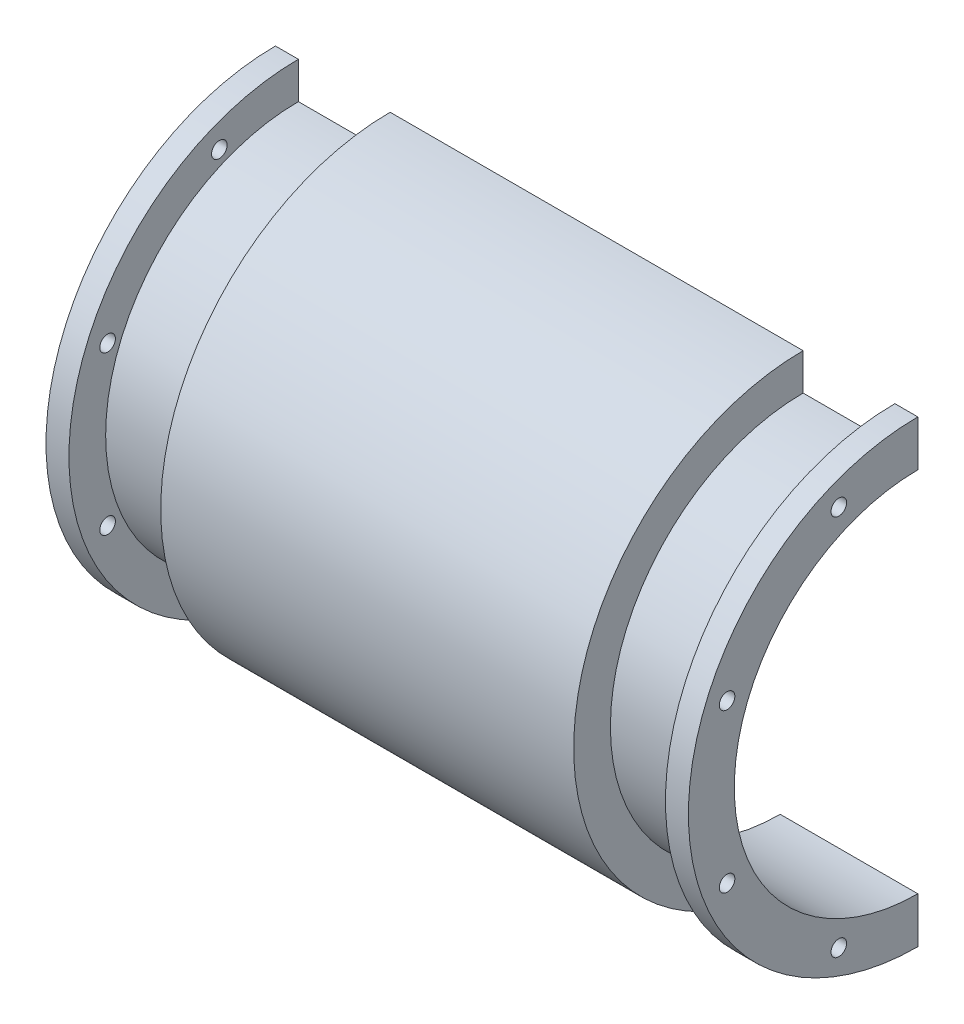
ISO-10303-21;
HEADER;
FILE_DESCRIPTION(('STEP AP214'),'2;1');
FILE_NAME('part.step','',(''),(''),'','','');
FILE_SCHEMA(('AUTOMOTIVE_DESIGN { 1 0 10303 214 1 1 1 1 }'));
ENDSEC;
DATA;
#1=APPLICATION_CONTEXT('core data for automotive mechanical design processes');
#2=APPLICATION_PROTOCOL_DEFINITION('international standard','automotive_design',2000,#1);
#3=PRODUCT_CONTEXT('',#1,'mechanical');
#4=PRODUCT('Part','Part','',(#3));
#5=PRODUCT_RELATED_PRODUCT_CATEGORY('part','',(#4));
#6=PRODUCT_DEFINITION_FORMATION('','',#4);
#7=PRODUCT_DEFINITION_CONTEXT('part definition',#1,'design');
#8=PRODUCT_DEFINITION('design','',#6,#7);
#9=PRODUCT_DEFINITION_SHAPE('','',#8);
#10=(LENGTH_UNIT() NAMED_UNIT(*) SI_UNIT(.MILLI.,.METRE.));
#11=(NAMED_UNIT(*) PLANE_ANGLE_UNIT() SI_UNIT($,.RADIAN.));
#12=(NAMED_UNIT(*) SI_UNIT($,.STERADIAN.) SOLID_ANGLE_UNIT());
#13=UNCERTAINTY_MEASURE_WITH_UNIT(LENGTH_MEASURE(1.E-05),#10,'distance_accuracy_value','');
#14=(GEOMETRIC_REPRESENTATION_CONTEXT(3) GLOBAL_UNCERTAINTY_ASSIGNED_CONTEXT((#13)) GLOBAL_UNIT_ASSIGNED_CONTEXT((#10,
#11,#12)) REPRESENTATION_CONTEXT('',''));
#15=CARTESIAN_POINT('',(0.,0.,0.));
#16=DIRECTION('',(0.,0.,1.));
#17=DIRECTION('',(1.,0.,0.));
#18=AXIS2_PLACEMENT_3D('',#15,#16,#17);
#19=CARTESIAN_POINT('',(70.,-40.,-2.79318507107451E-13));
#20=DIRECTION('',(-1.,0.,0.));
#21=DIRECTION('',(0.,-1.,0.));
#22=AXIS2_PLACEMENT_3D('',#19,#20,#21);
#23=PLANE('',#22);
#24=CARTESIAN_POINT('',(70.,17.2207544564289,41.5745789630079));
#25=DIRECTION('',(1.,0.,0.));
#26=DIRECTION('',(0.,0.,-1.));
#27=AXIS2_PLACEMENT_3D('',#24,#25,#26);
#28=CIRCLE('',#27,1.69999999999999);
#29=CARTESIAN_POINT('',(70.,17.2207544564289,39.874578963008));
#30=VERTEX_POINT('',#29);
#31=EDGE_CURVE('E527',#30,#30,#28,.T.);
#32=ORIENTED_EDGE('',*,*,#31,.F.);
#33=EDGE_LOOP('',(#32));
#34=FACE_BOUND('',#33,.T.);
#35=CARTESIAN_POINT('',(70.,-17.2207544564292,41.5745789630078));
#36=DIRECTION('',(1.,0.,0.));
#37=DIRECTION('',(0.,0.,-1.));
#38=AXIS2_PLACEMENT_3D('',#35,#36,#37);
#39=CIRCLE('',#38,1.69999999999999);
#40=CARTESIAN_POINT('',(70.,-17.2207544564292,39.8745789630078));
#41=VERTEX_POINT('',#40);
#42=EDGE_CURVE('E533',#41,#41,#39,.T.);
#43=ORIENTED_EDGE('',*,*,#42,.F.);
#44=EDGE_LOOP('',(#43));
#45=FACE_BOUND('',#44,.T.);
#46=CARTESIAN_POINT('',(70.,0.,0.));
#47=DIRECTION('',(-1.,0.,0.));
#48=DIRECTION('',(0.,-1.,0.));
#49=AXIS2_PLACEMENT_3D('',#46,#47,#48);
#50=CIRCLE('',#49,50.);
#51=CARTESIAN_POINT('',(70.,-50.,-3.49148133884313E-13));
#52=VERTEX_POINT('',#51);
#53=CARTESIAN_POINT('',(70.,50.,0.));
#54=VERTEX_POINT('',#53);
#55=EDGE_CURVE('E267',#52,#54,#50,.T.);
#56=ORIENTED_EDGE('',*,*,#55,.F.);
#57=DIRECTION('',(0.,-1.,0.));
#58=VECTOR('',#57,1.);
#59=CARTESIAN_POINT('',(70.,-40.,-2.79318507107451E-13));
#60=LINE('',#59,#58);
#61=CARTESIAN_POINT('',(70.,-40.,-2.79318507107451E-13));
#62=VERTEX_POINT('',#61);
#63=EDGE_CURVE('E220',#62,#52,#60,.T.);
#64=ORIENTED_EDGE('',*,*,#63,.F.);
#65=CARTESIAN_POINT('',(70.,0.,0.));
#66=DIRECTION('',(-1.,0.,0.));
#67=DIRECTION('',(0.,-1.,0.));
#68=AXIS2_PLACEMENT_3D('',#65,#66,#67);
#69=CIRCLE('',#68,40.);
#70=CARTESIAN_POINT('',(70.,40.,0.));
#71=VERTEX_POINT('',#70);
#72=EDGE_CURVE('E269',#62,#71,#69,.T.);
#73=ORIENTED_EDGE('',*,*,#72,.T.);
#74=DIRECTION('',(0.,1.,0.));
#75=VECTOR('',#74,1.);
#76=CARTESIAN_POINT('',(70.,40.,0.));
#77=LINE('',#76,#75);
#78=EDGE_CURVE('E182',#71,#54,#77,.T.);
#79=ORIENTED_EDGE('',*,*,#78,.T.);
#80=EDGE_LOOP('',(#56,#64,#73,#79));
#81=FACE_BOUND('',#80,.T.);
#82=CARTESIAN_POINT('',(70.,-41.574578963008,17.2207544564288));
#83=DIRECTION('',(1.,0.,0.));
#84=DIRECTION('',(0.,0.,-1.));
#85=AXIS2_PLACEMENT_3D('',#82,#83,#84);
#86=CIRCLE('',#85,1.69999999999999);
#87=CARTESIAN_POINT('',(70.,-41.574578963008,15.5207544564288));
#88=VERTEX_POINT('',#87);
#89=EDGE_CURVE('E521',#88,#88,#86,.T.);
#90=ORIENTED_EDGE('',*,*,#89,.F.);
#91=EDGE_LOOP('',(#90));
#92=FACE_BOUND('',#91,.T.);
#93=CARTESIAN_POINT('',(70.,41.5745789630079,17.2207544564291));
#94=DIRECTION('',(1.,0.,0.));
#95=DIRECTION('',(0.,0.,-1.));
#96=AXIS2_PLACEMENT_3D('',#93,#94,#95);
#97=CIRCLE('',#96,1.69999999999999);
#98=CARTESIAN_POINT('',(70.,41.5745789630079,15.5207544564291));
#99=VERTEX_POINT('',#98);
#100=EDGE_CURVE('E524',#99,#99,#97,.T.);
#101=ORIENTED_EDGE('',*,*,#100,.F.);
#102=EDGE_LOOP('',(#101));
#103=FACE_BOUND('',#102,.T.);
#104=ADVANCED_FACE('F39',(#34,#45,#81,#92,#103),#23,.F.);
#105=CARTESIAN_POINT('',(-70.,-50.,-3.49148133884313E-13));
#106=DIRECTION('',(1.,0.,0.));
#107=DIRECTION('',(0.,1.,0.));
#108=AXIS2_PLACEMENT_3D('',#105,#106,#107);
#109=PLANE('',#108);
#110=CARTESIAN_POINT('',(-70.,41.5745789630079,17.2207544564291));
#111=DIRECTION('',(-1.,0.,0.));
#112=DIRECTION('',(0.,0.,1.));
#113=AXIS2_PLACEMENT_3D('',#110,#111,#112);
#114=CIRCLE('',#113,1.69999999999999);
#115=CARTESIAN_POINT('',(-70.,41.5745789630079,18.9207544564291));
#116=VERTEX_POINT('',#115);
#117=EDGE_CURVE('E539',#116,#116,#114,.T.);
#118=ORIENTED_EDGE('',*,*,#117,.F.);
#119=EDGE_LOOP('',(#118));
#120=FACE_BOUND('',#119,.T.);
#121=CARTESIAN_POINT('',(-70.,17.2207544564289,41.5745789630079));
#122=DIRECTION('',(-1.,0.,0.));
#123=DIRECTION('',(0.,0.,1.));
#124=AXIS2_PLACEMENT_3D('',#121,#122,#123);
#125=CIRCLE('',#124,1.69999999999999);
#126=CARTESIAN_POINT('',(-70.,17.2207544564289,43.2745789630079));
#127=VERTEX_POINT('',#126);
#128=EDGE_CURVE('E545',#127,#127,#125,.T.);
#129=ORIENTED_EDGE('',*,*,#128,.F.);
#130=EDGE_LOOP('',(#129));
#131=FACE_BOUND('',#130,.T.);
#132=CARTESIAN_POINT('',(-70.,-17.2207544564292,41.5745789630078));
#133=DIRECTION('',(-1.,0.,0.));
#134=DIRECTION('',(0.,0.,1.));
#135=AXIS2_PLACEMENT_3D('',#132,#133,#134);
#136=CIRCLE('',#135,1.69999999999999);
#137=CARTESIAN_POINT('',(-70.,-17.2207544564292,43.2745789630078));
#138=VERTEX_POINT('',#137);
#139=EDGE_CURVE('E551',#138,#138,#136,.T.);
#140=ORIENTED_EDGE('',*,*,#139,.F.);
#141=EDGE_LOOP('',(#140));
#142=FACE_BOUND('',#141,.T.);
#143=CARTESIAN_POINT('',(-70.,-41.574578963008,17.2207544564288));
#144=DIRECTION('',(-1.,0.,0.));
#145=DIRECTION('',(0.,0.,1.));
#146=AXIS2_PLACEMENT_3D('',#143,#144,#145);
#147=CIRCLE('',#146,1.69999999999999);
#148=CARTESIAN_POINT('',(-70.,-41.574578963008,18.9207544564288));
#149=VERTEX_POINT('',#148);
#150=EDGE_CURVE('E557',#149,#149,#147,.T.);
#151=ORIENTED_EDGE('',*,*,#150,.F.);
#152=EDGE_LOOP('',(#151));
#153=FACE_BOUND('',#152,.T.);
#154=CARTESIAN_POINT('',(-70.,0.,0.));
#155=DIRECTION('',(-1.,0.,0.));
#156=DIRECTION('',(0.,-1.,0.));
#157=AXIS2_PLACEMENT_3D('',#154,#155,#156);
#158=CIRCLE('',#157,40.);
#159=CARTESIAN_POINT('',(-70.,-40.,-2.79318507107451E-13));
#160=VERTEX_POINT('',#159);
#161=CARTESIAN_POINT('',(-70.,40.,0.));
#162=VERTEX_POINT('',#161);
#163=EDGE_CURVE('E152',#160,#162,#158,.T.);
#164=ORIENTED_EDGE('',*,*,#163,.F.);
#165=DIRECTION('',(0.,1.,0.));
#166=VECTOR('',#165,1.);
#167=CARTESIAN_POINT('',(-70.,-50.,-3.49148133884313E-13));
#168=LINE('',#167,#166);
#169=CARTESIAN_POINT('',(-70.,-50.,-3.49148133884313E-13));
#170=VERTEX_POINT('',#169);
#171=EDGE_CURVE('E211',#170,#160,#168,.T.);
#172=ORIENTED_EDGE('',*,*,#171,.F.);
#173=CARTESIAN_POINT('',(-70.,0.,0.));
#174=DIRECTION('',(-1.,0.,0.));
#175=DIRECTION('',(0.,-1.,0.));
#176=AXIS2_PLACEMENT_3D('',#173,#174,#175);
#177=CIRCLE('',#176,50.);
#178=CARTESIAN_POINT('',(-70.,50.,0.));
#179=VERTEX_POINT('',#178);
#180=EDGE_CURVE('E168',#170,#179,#177,.T.);
#181=ORIENTED_EDGE('',*,*,#180,.T.);
#182=DIRECTION('',(0.,-1.,0.));
#183=VECTOR('',#182,1.);
#184=CARTESIAN_POINT('',(-70.,50.,0.));
#185=LINE('',#184,#183);
#186=EDGE_CURVE('E166',#179,#162,#185,.T.);
#187=ORIENTED_EDGE('',*,*,#186,.T.);
#188=EDGE_LOOP('',(#164,#172,#181,#187));
#189=FACE_BOUND('',#188,.T.);
#190=ADVANCED_FACE('F167',(#120,#131,#142,#153,#189),#109,.F.);
#191=CARTESIAN_POINT('',(-50.,0.,0.));
#192=DIRECTION('',(-1.,0.,0.));
#193=DIRECTION('',(0.,-1.,0.));
#194=AXIS2_PLACEMENT_3D('',#191,#192,#193);
#195=CYLINDRICAL_SURFACE('',#194,40.);
#196=CARTESIAN_POINT('',(-40.,0.,0.));
#197=DIRECTION('',(-1.,0.,0.));
#198=DIRECTION('',(0.,-1.,0.));
#199=AXIS2_PLACEMENT_3D('',#196,#197,#198);
#200=CIRCLE('',#199,40.);
#201=CARTESIAN_POINT('',(-40.,-40.,-2.79318507107451E-13));
#202=VERTEX_POINT('',#201);
#203=CARTESIAN_POINT('',(-40.,40.,0.));
#204=VERTEX_POINT('',#203);
#205=EDGE_CURVE('E163',#202,#204,#200,.T.);
#206=ORIENTED_EDGE('',*,*,#205,.F.);
#207=DIRECTION('',(1.,0.,0.));
#208=VECTOR('',#207,1.);
#209=CARTESIAN_POINT('',(-70.,-40.,-2.79318507107451E-13));
#210=LINE('',#209,#208);
#211=EDGE_CURVE('E158',#160,#202,#210,.T.);
#212=ORIENTED_EDGE('',*,*,#211,.F.);
#213=ORIENTED_EDGE('',*,*,#163,.T.);
#214=DIRECTION('',(1.,0.,0.));
#215=VECTOR('',#214,1.);
#216=CARTESIAN_POINT('',(-70.,40.,0.));
#217=LINE('',#216,#215);
#218=EDGE_CURVE('E156',#162,#204,#217,.T.);
#219=ORIENTED_EDGE('',*,*,#218,.T.);
#220=EDGE_LOOP('',(#206,#212,#213,#219));
#221=FACE_BOUND('',#220,.T.);
#222=ADVANCED_FACE('F154',(#221),#195,.F.);
#223=CARTESIAN_POINT('',(-50.,0.,0.));
#224=DIRECTION('',(-1.,0.,0.));
#225=DIRECTION('',(0.,-1.,0.));
#226=AXIS2_PLACEMENT_3D('',#223,#224,#225);
#227=CYLINDRICAL_SURFACE('',#226,49.);
#228=DIRECTION('',(1.,0.,0.));
#229=VECTOR('',#228,1.);
#230=CARTESIAN_POINT('',(-40.,-49.,-3.42165171206627E-13));
#231=LINE('',#230,#229);
#232=CARTESIAN_POINT('',(-30.9999999999999,-49.,-3.42165171206627E-13));
#233=VERTEX_POINT('',#232);
#234=CARTESIAN_POINT('',(31.,-49.,-3.42165171206627E-13));
#235=VERTEX_POINT('',#234);
#236=EDGE_CURVE('E214',#233,#235,#231,.T.);
#237=ORIENTED_EDGE('',*,*,#236,.F.);
#238=CARTESIAN_POINT('',(-31.,0.,0.));
#239=DIRECTION('',(-1.,0.,0.));
#240=DIRECTION('',(0.,-1.,0.));
#241=AXIS2_PLACEMENT_3D('',#238,#239,#240);
#242=CIRCLE('',#241,49.);
#243=CARTESIAN_POINT('',(-31.,49.,0.));
#244=VERTEX_POINT('',#243);
#245=EDGE_CURVE('E276',#233,#244,#242,.T.);
#246=ORIENTED_EDGE('',*,*,#245,.T.);
#247=DIRECTION('',(1.,0.,0.));
#248=VECTOR('',#247,1.);
#249=CARTESIAN_POINT('',(-40.,49.,0.));
#250=LINE('',#249,#248);
#251=CARTESIAN_POINT('',(31.,49.,0.));
#252=VERTEX_POINT('',#251);
#253=EDGE_CURVE('E174',#244,#252,#250,.T.);
#254=ORIENTED_EDGE('',*,*,#253,.T.);
#255=CARTESIAN_POINT('',(31.,0.,0.));
#256=DIRECTION('',(1.,0.,0.));
#257=DIRECTION('',(0.,1.,0.));
#258=AXIS2_PLACEMENT_3D('',#255,#256,#257);
#259=CIRCLE('',#258,49.);
#260=EDGE_CURVE('E162',#252,#235,#259,.T.);
#261=ORIENTED_EDGE('',*,*,#260,.T.);
#262=EDGE_LOOP('',(#237,#246,#254,#261));
#263=FACE_BOUND('',#262,.T.);
#264=ADVANCED_FACE('F286',(#263),#227,.F.);
#265=CARTESIAN_POINT('',(-50.,0.,0.));
#266=DIRECTION('',(-1.,0.,0.));
#267=DIRECTION('',(0.,-1.,0.));
#268=AXIS2_PLACEMENT_3D('',#265,#266,#267);
#269=CYLINDRICAL_SURFACE('',#268,40.);
#270=ORIENTED_EDGE('',*,*,#72,.F.);
#271=DIRECTION('',(1.,0.,0.));
#272=VECTOR('',#271,1.);
#273=CARTESIAN_POINT('',(40.,-40.,-2.79318507107451E-13));
#274=LINE('',#273,#272);
#275=CARTESIAN_POINT('',(40.,-40.,-2.79318507107451E-13));
#276=VERTEX_POINT('',#275);
#277=EDGE_CURVE('E217',#276,#62,#274,.T.);
#278=ORIENTED_EDGE('',*,*,#277,.F.);
#279=CARTESIAN_POINT('',(40.,0.,0.));
#280=DIRECTION('',(-1.,0.,0.));
#281=DIRECTION('',(0.,-1.,0.));
#282=AXIS2_PLACEMENT_3D('',#279,#280,#281);
#283=CIRCLE('',#282,40.);
#284=CARTESIAN_POINT('',(40.,40.,0.));
#285=VERTEX_POINT('',#284);
#286=EDGE_CURVE('E271',#276,#285,#283,.T.);
#287=ORIENTED_EDGE('',*,*,#286,.T.);
#288=DIRECTION('',(1.,0.,0.));
#289=VECTOR('',#288,1.);
#290=CARTESIAN_POINT('',(40.,40.,0.));
#291=LINE('',#290,#289);
#292=EDGE_CURVE('E176',#285,#71,#291,.T.);
#293=ORIENTED_EDGE('',*,*,#292,.T.);
#294=EDGE_LOOP('',(#270,#278,#287,#293));
#295=FACE_BOUND('',#294,.T.);
#296=ADVANCED_FACE('F317',(#295),#269,.F.);
#297=CARTESIAN_POINT('',(-50.,0.,0.));
#298=DIRECTION('',(-1.,0.,0.));
#299=DIRECTION('',(0.,-1.,0.));
#300=AXIS2_PLACEMENT_3D('',#297,#298,#299);
#301=CYLINDRICAL_SURFACE('',#300,50.);
#302=CARTESIAN_POINT('',(65.,0.,0.));
#303=DIRECTION('',(-1.,0.,0.));
#304=DIRECTION('',(0.,-1.,0.));
#305=AXIS2_PLACEMENT_3D('',#302,#303,#304);
#306=CIRCLE('',#305,50.);
#307=CARTESIAN_POINT('',(65.,-50.,-3.49148133884313E-13));
#308=VERTEX_POINT('',#307);
#309=CARTESIAN_POINT('',(65.,50.,0.));
#310=VERTEX_POINT('',#309);
#311=EDGE_CURVE('E265',#308,#310,#306,.T.);
#312=ORIENTED_EDGE('',*,*,#311,.F.);
#313=DIRECTION('',(-1.,0.,0.));
#314=VECTOR('',#313,1.);
#315=CARTESIAN_POINT('',(70.,-50.,-3.49148133884313E-13));
#316=LINE('',#315,#314);
#317=EDGE_CURVE('E223',#52,#308,#316,.T.);
#318=ORIENTED_EDGE('',*,*,#317,.F.);
#319=ORIENTED_EDGE('',*,*,#55,.T.);
#320=DIRECTION('',(-1.,0.,0.));
#321=VECTOR('',#320,1.);
#322=CARTESIAN_POINT('',(70.,50.,0.));
#323=LINE('',#322,#321);
#324=EDGE_CURVE('E185',#54,#310,#323,.T.);
#325=ORIENTED_EDGE('',*,*,#324,.T.);
#326=EDGE_LOOP('',(#312,#318,#319,#325));
#327=FACE_BOUND('',#326,.T.);
#328=ADVANCED_FACE('F315',(#327),#301,.T.);
#329=CARTESIAN_POINT('',(65.,-50.,-3.49148133884313E-13));
#330=DIRECTION('',(1.,0.,0.));
#331=DIRECTION('',(0.,1.,0.));
#332=AXIS2_PLACEMENT_3D('',#329,#330,#331);
#333=PLANE('',#332);
#334=CARTESIAN_POINT('',(65.,41.5745789630079,17.2207544564291));
#335=DIRECTION('',(1.,0.,0.));
#336=DIRECTION('',(0.,1.,0.));
#337=AXIS2_PLACEMENT_3D('',#334,#335,#336);
#338=CIRCLE('',#337,1.69999999999999);
#339=CARTESIAN_POINT('',(65.,43.2745789630079,17.2207544564291));
#340=VERTEX_POINT('',#339);
#341=EDGE_CURVE('E482',#340,#340,#338,.T.);
#342=ORIENTED_EDGE('',*,*,#341,.T.);
#343=EDGE_LOOP('',(#342));
#344=FACE_BOUND('',#343,.T.);
#345=CARTESIAN_POINT('',(65.,17.2207544564289,41.5745789630079));
#346=DIRECTION('',(1.,0.,0.));
#347=DIRECTION('',(0.,1.,0.));
#348=AXIS2_PLACEMENT_3D('',#345,#346,#347);
#349=CIRCLE('',#348,1.69999999999999);
#350=CARTESIAN_POINT('',(65.,18.9207544564289,41.5745789630079));
#351=VERTEX_POINT('',#350);
#352=EDGE_CURVE('E485',#351,#351,#349,.T.);
#353=ORIENTED_EDGE('',*,*,#352,.T.);
#354=EDGE_LOOP('',(#353));
#355=FACE_BOUND('',#354,.T.);
#356=CARTESIAN_POINT('',(65.,-17.2207544564292,41.5745789630078));
#357=DIRECTION('',(1.,0.,0.));
#358=DIRECTION('',(0.,1.,0.));
#359=AXIS2_PLACEMENT_3D('',#356,#357,#358);
#360=CIRCLE('',#359,1.69999999999999);
#361=CARTESIAN_POINT('',(65.,-15.5207544564292,41.5745789630078));
#362=VERTEX_POINT('',#361);
#363=EDGE_CURVE('E489',#362,#362,#360,.T.);
#364=ORIENTED_EDGE('',*,*,#363,.T.);
#365=EDGE_LOOP('',(#364));
#366=FACE_BOUND('',#365,.T.);
#367=CARTESIAN_POINT('',(65.,-41.574578963008,17.2207544564288));
#368=DIRECTION('',(1.,0.,0.));
#369=DIRECTION('',(0.,1.,0.));
#370=AXIS2_PLACEMENT_3D('',#367,#368,#369);
#371=CIRCLE('',#370,1.69999999999999);
#372=CARTESIAN_POINT('',(65.,-39.874578963008,17.2207544564288));
#373=VERTEX_POINT('',#372);
#374=EDGE_CURVE('E493',#373,#373,#371,.T.);
#375=ORIENTED_EDGE('',*,*,#374,.T.);
#376=EDGE_LOOP('',(#375));
#377=FACE_BOUND('',#376,.T.);
#378=CARTESIAN_POINT('',(65.,0.,0.));
#379=DIRECTION('',(-1.,0.,0.));
#380=DIRECTION('',(0.,-1.,0.));
#381=AXIS2_PLACEMENT_3D('',#378,#379,#380);
#382=CIRCLE('',#381,42.);
#383=CARTESIAN_POINT('',(65.,-42.,-2.93284432462823E-13));
#384=VERTEX_POINT('',#383);
#385=CARTESIAN_POINT('',(65.,42.,0.));
#386=VERTEX_POINT('',#385);
#387=EDGE_CURVE('E263',#384,#386,#382,.T.);
#388=ORIENTED_EDGE('',*,*,#387,.F.);
#389=DIRECTION('',(0.,1.,0.));
#390=VECTOR('',#389,1.);
#391=CARTESIAN_POINT('',(65.,-50.,-3.49148133884313E-13));
#392=LINE('',#391,#390);
#393=EDGE_CURVE('E226',#308,#384,#392,.T.);
#394=ORIENTED_EDGE('',*,*,#393,.F.);
#395=ORIENTED_EDGE('',*,*,#311,.T.);
#396=DIRECTION('',(0.,-1.,0.));
#397=VECTOR('',#396,1.);
#398=CARTESIAN_POINT('',(65.,50.,0.));
#399=LINE('',#398,#397);
#400=EDGE_CURVE('E188',#310,#386,#399,.T.);
#401=ORIENTED_EDGE('',*,*,#400,.T.);
#402=EDGE_LOOP('',(#388,#394,#395,#401));
#403=FACE_BOUND('',#402,.T.);
#404=ADVANCED_FACE('F472',(#344,#355,#366,#377,#403),#333,.F.);
#405=CARTESIAN_POINT('',(-50.,0.,0.));
#406=DIRECTION('',(-1.,0.,0.));
#407=DIRECTION('',(0.,-1.,0.));
#408=AXIS2_PLACEMENT_3D('',#405,#406,#407);
#409=CYLINDRICAL_SURFACE('',#408,42.);
#410=CARTESIAN_POINT('',(45.,0.,0.));
#411=DIRECTION('',(-1.,0.,0.));
#412=DIRECTION('',(0.,-1.,0.));
#413=AXIS2_PLACEMENT_3D('',#410,#411,#412);
#414=CIRCLE('',#413,42.);
#415=CARTESIAN_POINT('',(45.,-42.,-2.93284432462823E-13));
#416=VERTEX_POINT('',#415);
#417=CARTESIAN_POINT('',(45.,42.,0.));
#418=VERTEX_POINT('',#417);
#419=EDGE_CURVE('E261',#416,#418,#414,.T.);
#420=ORIENTED_EDGE('',*,*,#419,.F.);
#421=DIRECTION('',(-1.,0.,0.));
#422=VECTOR('',#421,1.);
#423=CARTESIAN_POINT('',(65.,-42.,-2.93284432462823E-13));
#424=LINE('',#423,#422);
#425=EDGE_CURVE('E229',#384,#416,#424,.T.);
#426=ORIENTED_EDGE('',*,*,#425,.F.);
#427=ORIENTED_EDGE('',*,*,#387,.T.);
#428=DIRECTION('',(-1.,0.,0.));
#429=VECTOR('',#428,1.);
#430=CARTESIAN_POINT('',(65.,42.,0.));
#431=LINE('',#430,#429);
#432=EDGE_CURVE('E191',#386,#418,#431,.T.);
#433=ORIENTED_EDGE('',*,*,#432,.T.);
#434=EDGE_LOOP('',(#420,#426,#427,#433));
#435=FACE_BOUND('',#434,.T.);
#436=ADVANCED_FACE('F469',(#435),#409,.T.);
#437=CARTESIAN_POINT('',(45.,-42.,-2.93284432462823E-13));
#438=DIRECTION('',(-1.,0.,0.));
#439=DIRECTION('',(0.,-1.,0.));
#440=AXIS2_PLACEMENT_3D('',#437,#438,#439);
#441=PLANE('',#440);
#442=CARTESIAN_POINT('',(45.,0.,0.));
#443=DIRECTION('',(-1.,0.,0.));
#444=DIRECTION('',(0.,-1.,0.));
#445=AXIS2_PLACEMENT_3D('',#442,#443,#444);
#446=CIRCLE('',#445,50.);
#447=CARTESIAN_POINT('',(45.,-50.,-3.49148133884313E-13));
#448=VERTEX_POINT('',#447);
#449=CARTESIAN_POINT('',(45.,50.,0.));
#450=VERTEX_POINT('',#449);
#451=EDGE_CURVE('E259',#448,#450,#446,.T.);
#452=ORIENTED_EDGE('',*,*,#451,.F.);
#453=DIRECTION('',(0.,-1.,0.));
#454=VECTOR('',#453,1.);
#455=CARTESIAN_POINT('',(45.,-42.,-2.93284432462823E-13));
#456=LINE('',#455,#454);
#457=EDGE_CURVE('E232',#416,#448,#456,.T.);
#458=ORIENTED_EDGE('',*,*,#457,.F.);
#459=ORIENTED_EDGE('',*,*,#419,.T.);
#460=DIRECTION('',(0.,1.,0.));
#461=VECTOR('',#460,1.);
#462=CARTESIAN_POINT('',(45.,42.,0.));
#463=LINE('',#462,#461);
#464=EDGE_CURVE('E194',#418,#450,#463,.T.);
#465=ORIENTED_EDGE('',*,*,#464,.T.);
#466=EDGE_LOOP('',(#452,#458,#459,#465));
#467=FACE_BOUND('',#466,.T.);
#468=ADVANCED_FACE('F465',(#467),#441,.F.);
#469=CARTESIAN_POINT('',(-50.,0.,0.));
#470=DIRECTION('',(-1.,0.,0.));
#471=DIRECTION('',(0.,-1.,0.));
#472=AXIS2_PLACEMENT_3D('',#469,#470,#471);
#473=CYLINDRICAL_SURFACE('',#472,50.);
#474=CARTESIAN_POINT('',(-45.,0.,0.));
#475=DIRECTION('',(-1.,0.,0.));
#476=DIRECTION('',(0.,-1.,0.));
#477=AXIS2_PLACEMENT_3D('',#474,#475,#476);
#478=CIRCLE('',#477,50.);
#479=CARTESIAN_POINT('',(-45.,-50.,-3.49148133884313E-13));
#480=VERTEX_POINT('',#479);
#481=CARTESIAN_POINT('',(-45.,50.,0.));
#482=VERTEX_POINT('',#481);
#483=EDGE_CURVE('E257',#480,#482,#478,.T.);
#484=ORIENTED_EDGE('',*,*,#483,.F.);
#485=DIRECTION('',(-1.,0.,0.));
#486=VECTOR('',#485,1.);
#487=CARTESIAN_POINT('',(45.,-50.,-3.49148133884313E-13));
#488=LINE('',#487,#486);
#489=EDGE_CURVE('E235',#448,#480,#488,.T.);
#490=ORIENTED_EDGE('',*,*,#489,.F.);
#491=ORIENTED_EDGE('',*,*,#451,.T.);
#492=DIRECTION('',(-1.,0.,0.));
#493=VECTOR('',#492,1.);
#494=CARTESIAN_POINT('',(45.,50.,0.));
#495=LINE('',#494,#493);
#496=EDGE_CURVE('E197',#450,#482,#495,.T.);
#497=ORIENTED_EDGE('',*,*,#496,.T.);
#498=EDGE_LOOP('',(#484,#490,#491,#497));
#499=FACE_BOUND('',#498,.T.);
#500=ADVANCED_FACE('F461',(#499),#473,.T.);
#501=CARTESIAN_POINT('',(-45.,-50.,-3.49148133884313E-13));
#502=DIRECTION('',(1.,0.,0.));
#503=DIRECTION('',(0.,1.,0.));
#504=AXIS2_PLACEMENT_3D('',#501,#502,#503);
#505=PLANE('',#504);
#506=CARTESIAN_POINT('',(-45.,0.,0.));
#507=DIRECTION('',(-1.,0.,0.));
#508=DIRECTION('',(0.,-1.,0.));
#509=AXIS2_PLACEMENT_3D('',#506,#507,#508);
#510=CIRCLE('',#509,42.);
#511=CARTESIAN_POINT('',(-45.,-42.,-2.93284432462823E-13));
#512=VERTEX_POINT('',#511);
#513=CARTESIAN_POINT('',(-45.,42.,0.));
#514=VERTEX_POINT('',#513);
#515=EDGE_CURVE('E255',#512,#514,#510,.T.);
#516=ORIENTED_EDGE('',*,*,#515,.F.);
#517=DIRECTION('',(0.,1.,0.));
#518=VECTOR('',#517,1.);
#519=CARTESIAN_POINT('',(-45.,-50.,-3.49148133884313E-13));
#520=LINE('',#519,#518);
#521=EDGE_CURVE('E238',#480,#512,#520,.T.);
#522=ORIENTED_EDGE('',*,*,#521,.F.);
#523=ORIENTED_EDGE('',*,*,#483,.T.);
#524=DIRECTION('',(0.,-1.,0.));
#525=VECTOR('',#524,1.);
#526=CARTESIAN_POINT('',(-45.,50.,0.));
#527=LINE('',#526,#525);
#528=EDGE_CURVE('E200',#482,#514,#527,.T.);
#529=ORIENTED_EDGE('',*,*,#528,.T.);
#530=EDGE_LOOP('',(#516,#522,#523,#529));
#531=FACE_BOUND('',#530,.T.);
#532=ADVANCED_FACE('F457',(#531),#505,.F.);
#533=CARTESIAN_POINT('',(-50.,0.,0.));
#534=DIRECTION('',(-1.,0.,0.));
#535=DIRECTION('',(0.,-1.,0.));
#536=AXIS2_PLACEMENT_3D('',#533,#534,#535);
#537=CYLINDRICAL_SURFACE('',#536,42.);
#538=CARTESIAN_POINT('',(-65.,0.,0.));
#539=DIRECTION('',(-1.,0.,0.));
#540=DIRECTION('',(0.,-1.,0.));
#541=AXIS2_PLACEMENT_3D('',#538,#539,#540);
#542=CIRCLE('',#541,42.);
#543=CARTESIAN_POINT('',(-65.,-42.,-2.93284432462823E-13));
#544=VERTEX_POINT('',#543);
#545=CARTESIAN_POINT('',(-65.,42.,0.));
#546=VERTEX_POINT('',#545);
#547=EDGE_CURVE('E253',#544,#546,#542,.T.);
#548=ORIENTED_EDGE('',*,*,#547,.F.);
#549=DIRECTION('',(-1.,0.,0.));
#550=VECTOR('',#549,1.);
#551=CARTESIAN_POINT('',(-45.,-42.,-2.93284432462823E-13));
#552=LINE('',#551,#550);
#553=EDGE_CURVE('E241',#512,#544,#552,.T.);
#554=ORIENTED_EDGE('',*,*,#553,.F.);
#555=ORIENTED_EDGE('',*,*,#515,.T.);
#556=DIRECTION('',(-1.,0.,0.));
#557=VECTOR('',#556,1.);
#558=CARTESIAN_POINT('',(-45.,42.,0.));
#559=LINE('',#558,#557);
#560=EDGE_CURVE('E203',#514,#546,#559,.T.);
#561=ORIENTED_EDGE('',*,*,#560,.T.);
#562=EDGE_LOOP('',(#548,#554,#555,#561));
#563=FACE_BOUND('',#562,.T.);
#564=ADVANCED_FACE('F453',(#563),#537,.T.);
#565=CARTESIAN_POINT('',(-65.,-42.,-2.93284432462823E-13));
#566=DIRECTION('',(-1.,0.,0.));
#567=DIRECTION('',(0.,-1.,0.));
#568=AXIS2_PLACEMENT_3D('',#565,#566,#567);
#569=PLANE('',#568);
#570=CARTESIAN_POINT('',(-65.,41.5745789630079,17.2207544564291));
#571=DIRECTION('',(-1.,0.,0.));
#572=DIRECTION('',(0.,-1.,0.));
#573=AXIS2_PLACEMENT_3D('',#570,#571,#572);
#574=CIRCLE('',#573,1.69999999999999);
#575=CARTESIAN_POINT('',(-65.,39.8745789630079,17.2207544564291));
#576=VERTEX_POINT('',#575);
#577=EDGE_CURVE('E542',#576,#576,#574,.T.);
#578=ORIENTED_EDGE('',*,*,#577,.T.);
#579=EDGE_LOOP('',(#578));
#580=FACE_BOUND('',#579,.T.);
#581=CARTESIAN_POINT('',(-65.,17.2207544564289,41.5745789630079));
#582=DIRECTION('',(-1.,0.,0.));
#583=DIRECTION('',(0.,-1.,0.));
#584=AXIS2_PLACEMENT_3D('',#581,#582,#583);
#585=CIRCLE('',#584,1.69999999999999);
#586=CARTESIAN_POINT('',(-65.,15.5207544564289,41.5745789630079));
#587=VERTEX_POINT('',#586);
#588=EDGE_CURVE('E548',#587,#587,#585,.T.);
#589=ORIENTED_EDGE('',*,*,#588,.T.);
#590=EDGE_LOOP('',(#589));
#591=FACE_BOUND('',#590,.T.);
#592=CARTESIAN_POINT('',(-65.,-17.2207544564292,41.5745789630078));
#593=DIRECTION('',(-1.,0.,0.));
#594=DIRECTION('',(0.,-1.,0.));
#595=AXIS2_PLACEMENT_3D('',#592,#593,#594);
#596=CIRCLE('',#595,1.69999999999999);
#597=CARTESIAN_POINT('',(-65.,-18.9207544564292,41.5745789630078));
#598=VERTEX_POINT('',#597);
#599=EDGE_CURVE('E554',#598,#598,#596,.T.);
#600=ORIENTED_EDGE('',*,*,#599,.T.);
#601=EDGE_LOOP('',(#600));
#602=FACE_BOUND('',#601,.T.);
#603=CARTESIAN_POINT('',(-65.,-41.574578963008,17.2207544564288));
#604=DIRECTION('',(-1.,0.,0.));
#605=DIRECTION('',(0.,-1.,0.));
#606=AXIS2_PLACEMENT_3D('',#603,#604,#605);
#607=CIRCLE('',#606,1.69999999999999);
#608=CARTESIAN_POINT('',(-65.,-43.274578963008,17.2207544564288));
#609=VERTEX_POINT('',#608);
#610=EDGE_CURVE('E171',#609,#609,#607,.T.);
#611=ORIENTED_EDGE('',*,*,#610,.T.);
#612=EDGE_LOOP('',(#611));
#613=FACE_BOUND('',#612,.T.);
#614=CARTESIAN_POINT('',(-65.,0.,0.));
#615=DIRECTION('',(-1.,0.,0.));
#616=DIRECTION('',(0.,-1.,0.));
#617=AXIS2_PLACEMENT_3D('',#614,#615,#616);
#618=CIRCLE('',#617,50.);
#619=CARTESIAN_POINT('',(-65.,-50.,-3.49148133884313E-13));
#620=VERTEX_POINT('',#619);
#621=CARTESIAN_POINT('',(-65.,50.,0.));
#622=VERTEX_POINT('',#621);
#623=EDGE_CURVE('E251',#620,#622,#618,.T.);
#624=ORIENTED_EDGE('',*,*,#623,.F.);
#625=DIRECTION('',(0.,-1.,0.));
#626=VECTOR('',#625,1.);
#627=CARTESIAN_POINT('',(-65.,-42.,-2.93284432462823E-13));
#628=LINE('',#627,#626);
#629=EDGE_CURVE('E244',#544,#620,#628,.T.);
#630=ORIENTED_EDGE('',*,*,#629,.F.);
#631=ORIENTED_EDGE('',*,*,#547,.T.);
#632=DIRECTION('',(0.,1.,0.));
#633=VECTOR('',#632,1.);
#634=CARTESIAN_POINT('',(-65.,42.,0.));
#635=LINE('',#634,#633);
#636=EDGE_CURVE('E206',#546,#622,#635,.T.);
#637=ORIENTED_EDGE('',*,*,#636,.T.);
#638=EDGE_LOOP('',(#624,#630,#631,#637));
#639=FACE_BOUND('',#638,.T.);
#640=ADVANCED_FACE('F450',(#580,#591,#602,#613,#639),#569,.F.);
#641=CARTESIAN_POINT('',(-50.,0.,0.));
#642=DIRECTION('',(-1.,0.,0.));
#643=DIRECTION('',(0.,-1.,0.));
#644=AXIS2_PLACEMENT_3D('',#641,#642,#643);
#645=CYLINDRICAL_SURFACE('',#644,50.);
#646=DIRECTION('',(-1.,0.,0.));
#647=VECTOR('',#646,1.);
#648=CARTESIAN_POINT('',(-65.,-50.,-3.49148133884313E-13));
#649=LINE('',#648,#647);
#650=EDGE_CURVE('E247',#620,#170,#649,.T.);
#651=ORIENTED_EDGE('',*,*,#650,.F.);
#652=ORIENTED_EDGE('',*,*,#623,.T.);
#653=DIRECTION('',(-1.,0.,0.));
#654=VECTOR('',#653,1.);
#655=CARTESIAN_POINT('',(-65.,50.,0.));
#656=LINE('',#655,#654);
#657=EDGE_CURVE('E209',#622,#179,#656,.T.);
#658=ORIENTED_EDGE('',*,*,#657,.T.);
#659=ORIENTED_EDGE('',*,*,#180,.F.);
#660=EDGE_LOOP('',(#651,#652,#658,#659));
#661=FACE_BOUND('',#660,.T.);
#662=ADVANCED_FACE('F346',(#661),#645,.T.);
#663=CARTESIAN_POINT('',(0.,0.,0.));
#664=DIRECTION('',(0.,0.,-1.));
#665=DIRECTION('',(1.,0.,0.));
#666=AXIS2_PLACEMENT_3D('',#663,#664,#665);
#667=PLANE('',#666);
#668=ORIENTED_EDGE('',*,*,#171,.T.);
#669=ORIENTED_EDGE('',*,*,#211,.T.);
#670=CARTESIAN_POINT('',(-31.,-40.,-2.79318507107451E-13));
#671=DIRECTION('',(0.,0.,-1.));
#672=DIRECTION('',(0.,1.,0.));
#673=AXIS2_PLACEMENT_3D('',#670,#671,#672);
#674=CIRCLE('',#673,9.);
#675=EDGE_CURVE('E279',#202,#233,#674,.F.);
#676=ORIENTED_EDGE('',*,*,#675,.T.);
#677=ORIENTED_EDGE('',*,*,#236,.T.);
#678=CARTESIAN_POINT('',(31.,-40.,-2.79318507107451E-13));
#679=DIRECTION('',(0.,0.,-1.));
#680=DIRECTION('',(0.,1.,0.));
#681=AXIS2_PLACEMENT_3D('',#678,#679,#680);
#682=CIRCLE('',#681,9.);
#683=EDGE_CURVE('E11',#235,#276,#682,.F.);
#684=ORIENTED_EDGE('',*,*,#683,.T.);
#685=ORIENTED_EDGE('',*,*,#277,.T.);
#686=ORIENTED_EDGE('',*,*,#63,.T.);
#687=ORIENTED_EDGE('',*,*,#317,.T.);
#688=ORIENTED_EDGE('',*,*,#393,.T.);
#689=ORIENTED_EDGE('',*,*,#425,.T.);
#690=ORIENTED_EDGE('',*,*,#457,.T.);
#691=ORIENTED_EDGE('',*,*,#489,.T.);
#692=ORIENTED_EDGE('',*,*,#521,.T.);
#693=ORIENTED_EDGE('',*,*,#553,.T.);
#694=ORIENTED_EDGE('',*,*,#629,.T.);
#695=ORIENTED_EDGE('',*,*,#650,.T.);
#696=EDGE_LOOP('',(#668,#669,#676,#677,#684,#685,#686,#687,#688,#689,#690,#691,#692,#693,#694,#695));
#697=FACE_BOUND('',#696,.T.);
#698=ADVANCED_FACE('F283',(#697),#667,.T.);
#699=CARTESIAN_POINT('',(0.,0.,0.));
#700=DIRECTION('',(0.,0.,1.));
#701=DIRECTION('',(1.,0.,0.));
#702=AXIS2_PLACEMENT_3D('',#699,#700,#701);
#703=PLANE('',#702);
#704=ORIENTED_EDGE('',*,*,#186,.F.);
#705=ORIENTED_EDGE('',*,*,#657,.F.);
#706=ORIENTED_EDGE('',*,*,#636,.F.);
#707=ORIENTED_EDGE('',*,*,#560,.F.);
#708=ORIENTED_EDGE('',*,*,#528,.F.);
#709=ORIENTED_EDGE('',*,*,#496,.F.);
#710=ORIENTED_EDGE('',*,*,#464,.F.);
#711=ORIENTED_EDGE('',*,*,#432,.F.);
#712=ORIENTED_EDGE('',*,*,#400,.F.);
#713=ORIENTED_EDGE('',*,*,#324,.F.);
#714=ORIENTED_EDGE('',*,*,#78,.F.);
#715=ORIENTED_EDGE('',*,*,#292,.F.);
#716=CARTESIAN_POINT('',(31.,40.,0.));
#717=DIRECTION('',(0.,0.,1.));
#718=DIRECTION('',(1.,0.,0.));
#719=AXIS2_PLACEMENT_3D('',#716,#717,#718);
#720=CIRCLE('',#719,9.);
#721=EDGE_CURVE('E47',#285,#252,#720,.T.);
#722=ORIENTED_EDGE('',*,*,#721,.T.);
#723=ORIENTED_EDGE('',*,*,#253,.F.);
#724=CARTESIAN_POINT('',(-31.,40.,0.));
#725=DIRECTION('',(0.,0.,1.));
#726=DIRECTION('',(1.,0.,0.));
#727=AXIS2_PLACEMENT_3D('',#724,#725,#726);
#728=CIRCLE('',#727,9.);
#729=EDGE_CURVE('E61',#244,#204,#728,.T.);
#730=ORIENTED_EDGE('',*,*,#729,.T.);
#731=ORIENTED_EDGE('',*,*,#218,.F.);
#732=EDGE_LOOP('',(#704,#705,#706,#707,#708,#709,#710,#711,#712,#713,#714,#715,#722,#723,#730,#731));
#733=FACE_BOUND('',#732,.T.);
#734=ADVANCED_FACE('F173',(#733),#703,.F.);
#735=CARTESIAN_POINT('',(-70.,-41.574578963008,17.2207544564288));
#736=DIRECTION('',(-1.,0.,0.));
#737=DIRECTION('',(0.,0.,1.));
#738=AXIS2_PLACEMENT_3D('',#735,#736,#737);
#739=CYLINDRICAL_SURFACE('',#738,1.69999999999999);
#740=ORIENTED_EDGE('',*,*,#610,.F.);
#741=EDGE_LOOP('',(#740));
#742=FACE_BOUND('',#741,.T.);
#743=ORIENTED_EDGE('',*,*,#150,.T.);
#744=EDGE_LOOP('',(#743));
#745=FACE_BOUND('',#744,.T.);
#746=ADVANCED_FACE('F354',(#742,#745),#739,.F.);
#747=CARTESIAN_POINT('',(-70.,-17.2207544564292,41.5745789630078));
#748=DIRECTION('',(-1.,0.,0.));
#749=DIRECTION('',(0.,0.,1.));
#750=AXIS2_PLACEMENT_3D('',#747,#748,#749);
#751=CYLINDRICAL_SURFACE('',#750,1.69999999999999);
#752=ORIENTED_EDGE('',*,*,#599,.F.);
#753=EDGE_LOOP('',(#752));
#754=FACE_BOUND('',#753,.T.);
#755=ORIENTED_EDGE('',*,*,#139,.T.);
#756=EDGE_LOOP('',(#755));
#757=FACE_BOUND('',#756,.T.);
#758=ADVANCED_FACE('F366',(#754,#757),#751,.F.);
#759=CARTESIAN_POINT('',(-70.,17.2207544564289,41.5745789630079));
#760=DIRECTION('',(-1.,0.,0.));
#761=DIRECTION('',(0.,0.,1.));
#762=AXIS2_PLACEMENT_3D('',#759,#760,#761);
#763=CYLINDRICAL_SURFACE('',#762,1.69999999999999);
#764=ORIENTED_EDGE('',*,*,#588,.F.);
#765=EDGE_LOOP('',(#764));
#766=FACE_BOUND('',#765,.T.);
#767=ORIENTED_EDGE('',*,*,#128,.T.);
#768=EDGE_LOOP('',(#767));
#769=FACE_BOUND('',#768,.T.);
#770=ADVANCED_FACE('F377',(#766,#769),#763,.F.);
#771=CARTESIAN_POINT('',(-70.,41.5745789630079,17.2207544564291));
#772=DIRECTION('',(-1.,0.,0.));
#773=DIRECTION('',(0.,0.,1.));
#774=AXIS2_PLACEMENT_3D('',#771,#772,#773);
#775=CYLINDRICAL_SURFACE('',#774,1.69999999999999);
#776=ORIENTED_EDGE('',*,*,#577,.F.);
#777=EDGE_LOOP('',(#776));
#778=FACE_BOUND('',#777,.T.);
#779=ORIENTED_EDGE('',*,*,#117,.T.);
#780=EDGE_LOOP('',(#779));
#781=FACE_BOUND('',#780,.T.);
#782=ADVANCED_FACE('F388',(#778,#781),#775,.F.);
#783=CARTESIAN_POINT('',(70.,-41.574578963008,17.2207544564288));
#784=DIRECTION('',(1.,0.,0.));
#785=DIRECTION('',(0.,0.,-1.));
#786=AXIS2_PLACEMENT_3D('',#783,#784,#785);
#787=CYLINDRICAL_SURFACE('',#786,1.69999999999999);
#788=ORIENTED_EDGE('',*,*,#374,.F.);
#789=EDGE_LOOP('',(#788));
#790=FACE_BOUND('',#789,.T.);
#791=ORIENTED_EDGE('',*,*,#89,.T.);
#792=EDGE_LOOP('',(#791));
#793=FACE_BOUND('',#792,.T.);
#794=ADVANCED_FACE('F396',(#790,#793),#787,.F.);
#795=CARTESIAN_POINT('',(70.,-17.2207544564292,41.5745789630078));
#796=DIRECTION('',(1.,0.,0.));
#797=DIRECTION('',(0.,0.,-1.));
#798=AXIS2_PLACEMENT_3D('',#795,#796,#797);
#799=CYLINDRICAL_SURFACE('',#798,1.69999999999999);
#800=ORIENTED_EDGE('',*,*,#363,.F.);
#801=EDGE_LOOP('',(#800));
#802=FACE_BOUND('',#801,.T.);
#803=ORIENTED_EDGE('',*,*,#42,.T.);
#804=EDGE_LOOP('',(#803));
#805=FACE_BOUND('',#804,.T.);
#806=ADVANCED_FACE('F411',(#802,#805),#799,.F.);
#807=CARTESIAN_POINT('',(70.,17.2207544564289,41.5745789630079));
#808=DIRECTION('',(1.,0.,0.));
#809=DIRECTION('',(0.,0.,-1.));
#810=AXIS2_PLACEMENT_3D('',#807,#808,#809);
#811=CYLINDRICAL_SURFACE('',#810,1.69999999999999);
#812=ORIENTED_EDGE('',*,*,#352,.F.);
#813=EDGE_LOOP('',(#812));
#814=FACE_BOUND('',#813,.T.);
#815=ORIENTED_EDGE('',*,*,#31,.T.);
#816=EDGE_LOOP('',(#815));
#817=FACE_BOUND('',#816,.T.);
#818=ADVANCED_FACE('F297',(#814,#817),#811,.F.);
#819=CARTESIAN_POINT('',(70.,41.5745789630079,17.2207544564291));
#820=DIRECTION('',(1.,0.,0.));
#821=DIRECTION('',(0.,0.,-1.));
#822=AXIS2_PLACEMENT_3D('',#819,#820,#821);
#823=CYLINDRICAL_SURFACE('',#822,1.69999999999999);
#824=ORIENTED_EDGE('',*,*,#341,.F.);
#825=EDGE_LOOP('',(#824));
#826=FACE_BOUND('',#825,.T.);
#827=ORIENTED_EDGE('',*,*,#100,.T.);
#828=EDGE_LOOP('',(#827));
#829=FACE_BOUND('',#828,.T.);
#830=ADVANCED_FACE('F290',(#826,#829),#823,.F.);
#831=CARTESIAN_POINT('',(-31.,0.,0.));
#832=DIRECTION('',(-1.,0.,0.));
#833=DIRECTION('',(0.,-1.,0.));
#834=AXIS2_PLACEMENT_3D('',#831,#832,#833);
#835=TOROIDAL_SURFACE('',#834,40.,9.);
#836=ORIENTED_EDGE('',*,*,#675,.F.);
#837=ORIENTED_EDGE('',*,*,#205,.T.);
#838=ORIENTED_EDGE('',*,*,#729,.F.);
#839=ORIENTED_EDGE('',*,*,#245,.F.);
#840=EDGE_LOOP('',(#836,#837,#838,#839));
#841=FACE_BOUND('',#840,.T.);
#842=ADVANCED_FACE('F288',(#841),#835,.F.);
#843=CARTESIAN_POINT('',(31.,0.,0.));
#844=DIRECTION('',(1.,0.,0.));
#845=DIRECTION('',(0.,1.,0.));
#846=AXIS2_PLACEMENT_3D('',#843,#844,#845);
#847=TOROIDAL_SURFACE('',#846,40.,9.);
#848=ORIENTED_EDGE('',*,*,#683,.F.);
#849=ORIENTED_EDGE('',*,*,#260,.F.);
#850=ORIENTED_EDGE('',*,*,#721,.F.);
#851=ORIENTED_EDGE('',*,*,#286,.F.);
#852=EDGE_LOOP('',(#848,#849,#850,#851));
#853=FACE_BOUND('',#852,.T.);
#854=ADVANCED_FACE('F41',(#853),#847,.F.);
#855=CLOSED_SHELL('',(#104,#190,#222,#264,#296,#328,#404,#436,#468,#500,#532,#564,#640,#662,
#698,#734,#746,#758,#770,#782,#794,#806,#818,#830,#842,#854));
#856=MANIFOLD_SOLID_BREP('B2',#855);
#857=ADVANCED_BREP_SHAPE_REPRESENTATION('',(#18,#856),#14);
#858=SHAPE_DEFINITION_REPRESENTATION(#9,#857);
ENDSEC;
END-ISO-10303-21;
